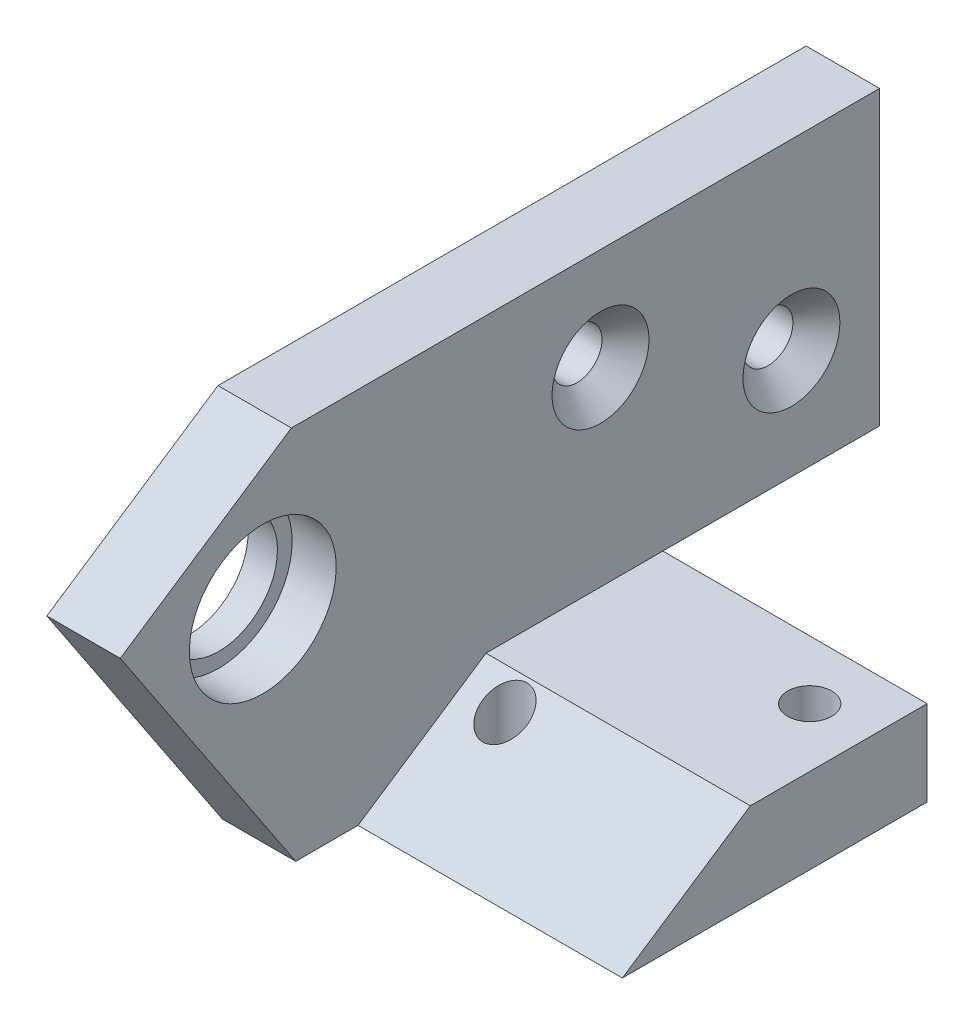
ISO-10303-21;
HEADER;
FILE_DESCRIPTION(('STEP AP214'),'2;1');
FILE_NAME('part.step','',(''),(''),'','','');
FILE_SCHEMA(('AUTOMOTIVE_DESIGN { 1 0 10303 214 1 1 1 1 }'));
ENDSEC;
DATA;
#1=APPLICATION_CONTEXT('core data for automotive mechanical design processes');
#2=APPLICATION_PROTOCOL_DEFINITION('international standard','automotive_design',2000,#1);
#3=PRODUCT_CONTEXT('',#1,'mechanical');
#4=PRODUCT('Part','Part','',(#3));
#5=PRODUCT_RELATED_PRODUCT_CATEGORY('part','',(#4));
#6=PRODUCT_DEFINITION_FORMATION('','',#4);
#7=PRODUCT_DEFINITION_CONTEXT('part definition',#1,'design');
#8=PRODUCT_DEFINITION('design','',#6,#7);
#9=PRODUCT_DEFINITION_SHAPE('','',#8);
#10=(LENGTH_UNIT() NAMED_UNIT(*) SI_UNIT(.MILLI.,.METRE.));
#11=(NAMED_UNIT(*) PLANE_ANGLE_UNIT() SI_UNIT($,.RADIAN.));
#12=(NAMED_UNIT(*) SI_UNIT($,.STERADIAN.) SOLID_ANGLE_UNIT());
#13=UNCERTAINTY_MEASURE_WITH_UNIT(LENGTH_MEASURE(1.E-05),#10,'distance_accuracy_value','');
#14=(GEOMETRIC_REPRESENTATION_CONTEXT(3) GLOBAL_UNCERTAINTY_ASSIGNED_CONTEXT((#13)) GLOBAL_UNIT_ASSIGNED_CONTEXT((#10,
#11,#12)) REPRESENTATION_CONTEXT('',''));
#15=CARTESIAN_POINT('',(0.,0.,0.));
#16=DIRECTION('',(0.,0.,1.));
#17=DIRECTION('',(1.,0.,0.));
#18=AXIS2_PLACEMENT_3D('',#15,#16,#17);
#19=CARTESIAN_POINT('',(0.,0.,0.));
#20=DIRECTION('',(1.,0.,0.));
#21=DIRECTION('',(0.,0.,-1.));
#22=AXIS2_PLACEMENT_3D('',#19,#20,#21);
#23=PLANE('',#22);
#24=DIRECTION('',(0.,0.,-1.));
#25=VECTOR('',#24,1.);
#26=CARTESIAN_POINT('',(0.,0.,-25.));
#27=LINE('',#26,#25);
#28=CARTESIAN_POINT('',(0.,0.,-4.24463236054693));
#29=VERTEX_POINT('',#28);
#30=CARTESIAN_POINT('',(0.,0.,-25.));
#31=VERTEX_POINT('',#30);
#32=EDGE_CURVE('E128',#29,#31,#27,.T.);
#33=ORIENTED_EDGE('',*,*,#32,.T.);
#34=DIRECTION('',(0.,1.,0.));
#35=VECTOR('',#34,1.);
#36=CARTESIAN_POINT('',(0.,5.79991849324796,-25.));
#37=LINE('',#36,#35);
#38=CARTESIAN_POINT('',(0.,5.79991849324796,-25.));
#39=VERTEX_POINT('',#38);
#40=EDGE_CURVE('E113',#31,#39,#37,.T.);
#41=ORIENTED_EDGE('',*,*,#40,.T.);
#42=DIRECTION('',(0.,0.,1.));
#43=VECTOR('',#42,1.);
#44=CARTESIAN_POINT('',(0.,5.79991849324796,-12.9573640104081));
#45=LINE('',#44,#43);
#46=CARTESIAN_POINT('',(0.,5.79991849324796,-12.9573640104081));
#47=VERTEX_POINT('',#46);
#48=EDGE_CURVE('E124',#39,#47,#45,.T.);
#49=ORIENTED_EDGE('',*,*,#48,.T.);
#50=DIRECTION('',(0.,0.554133260159787,-0.832427972850917));
#51=VECTOR('',#50,1.);
#52=CARTESIAN_POINT('',(0.,-1.95794714898904,-1.30337239049531));
#53=LINE('',#52,#51);
#54=EDGE_CURVE('E127',#29,#47,#53,.T.);
#55=ORIENTED_EDGE('',*,*,#54,.F.);
#56=EDGE_LOOP('',(#33,#41,#49,#55));
#57=FACE_BOUND('',#56,.T.);
#58=ADVANCED_FACE('F33',(#57),#23,.T.);
#59=CARTESIAN_POINT('',(-21.,16.,2.24179415327121));
#60=DIRECTION('',(-1.,0.,0.));
#61=DIRECTION('',(0.,0.,-1.));
#62=AXIS2_PLACEMENT_3D('',#59,#60,#61);
#63=PLANE('',#62);
#64=CARTESIAN_POINT('',(-21.,16.,2.24179415327121));
#65=DIRECTION('',(1.,0.,0.));
#66=DIRECTION('',(0.,0.,-1.));
#67=AXIS2_PLACEMENT_3D('',#64,#65,#66);
#68=CIRCLE('',#67,5.);
#69=CARTESIAN_POINT('',(-21.,16.,-2.75820584672879));
#70=VERTEX_POINT('',#69);
#71=EDGE_CURVE('E166',#70,#70,#68,.T.);
#72=ORIENTED_EDGE('',*,*,#71,.T.);
#73=EDGE_LOOP('',(#72));
#74=FACE_BOUND('',#73,.T.);
#75=CARTESIAN_POINT('',(-21.,16.,2.24179415327121));
#76=DIRECTION('',(1.,0.,0.));
#77=DIRECTION('',(0.,0.,-1.));
#78=AXIS2_PLACEMENT_3D('',#75,#76,#77);
#79=CIRCLE('',#78,4.);
#80=CARTESIAN_POINT('',(-21.,16.,-1.75820584672879));
#81=VERTEX_POINT('',#80);
#82=EDGE_CURVE('E170',#81,#81,#79,.T.);
#83=ORIENTED_EDGE('',*,*,#82,.F.);
#84=EDGE_LOOP('',(#83));
#85=FACE_BOUND('',#84,.T.);
#86=ADVANCED_FACE('F268',(#74,#85),#63,.F.);
#87=CARTESIAN_POINT('',(-21.,16.,2.24179415327121));
#88=DIRECTION('',(-1.,0.,0.));
#89=DIRECTION('',(0.,0.,1.));
#90=AXIS2_PLACEMENT_3D('',#87,#88,#89);
#91=CYLINDRICAL_SURFACE('',#90,4.);
#92=ORIENTED_EDGE('',*,*,#82,.T.);
#93=EDGE_LOOP('',(#92));
#94=FACE_BOUND('',#93,.T.);
#95=CARTESIAN_POINT('',(-23.,16.,2.24179415327121));
#96=DIRECTION('',(1.,0.,0.));
#97=DIRECTION('',(0.,0.,-1.));
#98=AXIS2_PLACEMENT_3D('',#95,#96,#97);
#99=CIRCLE('',#98,4.);
#100=CARTESIAN_POINT('',(-23.,16.,-1.75820584672879));
#101=VERTEX_POINT('',#100);
#102=EDGE_CURVE('E171',#101,#101,#99,.T.);
#103=ORIENTED_EDGE('',*,*,#102,.F.);
#104=EDGE_LOOP('',(#103));
#105=FACE_BOUND('',#104,.T.);
#106=ADVANCED_FACE('F263',(#94,#105),#91,.F.);
#107=CARTESIAN_POINT('',(-18.,18.75,-20.7582058467288));
#108=DIRECTION('',(1.,0.,0.));
#109=DIRECTION('',(0.,0.,-1.));
#110=AXIS2_PLACEMENT_3D('',#107,#108,#109);
#111=CYLINDRICAL_SURFACE('',#110,1.69999999999999);
#112=CARTESIAN_POINT('',(-19.6,18.75,-20.7582058467288));
#113=DIRECTION('',(1.,0.,0.));
#114=DIRECTION('',(0.,0.,-1.));
#115=AXIS2_PLACEMENT_3D('',#112,#113,#114);
#116=CIRCLE('',#115,1.69999999999999);
#117=CARTESIAN_POINT('',(-19.6,18.75,-22.4582058467288));
#118=VERTEX_POINT('',#117);
#119=EDGE_CURVE('E197',#118,#118,#116,.T.);
#120=ORIENTED_EDGE('',*,*,#119,.T.);
#121=EDGE_LOOP('',(#120));
#122=FACE_BOUND('',#121,.T.);
#123=CARTESIAN_POINT('',(-23.,18.75,-20.7582058467288));
#124=DIRECTION('',(1.,0.,0.));
#125=DIRECTION('',(0.,0.,-1.));
#126=AXIS2_PLACEMENT_3D('',#123,#124,#125);
#127=CIRCLE('',#126,1.69999999999999);
#128=CARTESIAN_POINT('',(-23.,18.75,-22.4582058467288));
#129=VERTEX_POINT('',#128);
#130=EDGE_CURVE('E192',#129,#129,#127,.T.);
#131=ORIENTED_EDGE('',*,*,#130,.F.);
#132=EDGE_LOOP('',(#131));
#133=FACE_BOUND('',#132,.T.);
#134=ADVANCED_FACE('F253',(#122,#133),#111,.F.);
#135=CARTESIAN_POINT('',(-18.,13.25,-33.7582058467288));
#136=DIRECTION('',(1.,0.,0.));
#137=DIRECTION('',(0.,0.,-1.));
#138=AXIS2_PLACEMENT_3D('',#135,#136,#137);
#139=CYLINDRICAL_SURFACE('',#138,1.69999999999999);
#140=CARTESIAN_POINT('',(-19.6,13.25,-33.7582058467288));
#141=DIRECTION('',(1.,0.,0.));
#142=DIRECTION('',(0.,0.,-1.));
#143=AXIS2_PLACEMENT_3D('',#140,#141,#142);
#144=CIRCLE('',#143,1.69999999999999);
#145=CARTESIAN_POINT('',(-19.6,13.25,-35.4582058467288));
#146=VERTEX_POINT('',#145);
#147=EDGE_CURVE('E204',#146,#146,#144,.T.);
#148=ORIENTED_EDGE('',*,*,#147,.T.);
#149=EDGE_LOOP('',(#148));
#150=FACE_BOUND('',#149,.T.);
#151=CARTESIAN_POINT('',(-23.,13.25,-33.7582058467288));
#152=DIRECTION('',(1.,0.,0.));
#153=DIRECTION('',(0.,0.,-1.));
#154=AXIS2_PLACEMENT_3D('',#151,#152,#153);
#155=CIRCLE('',#154,1.69999999999999);
#156=CARTESIAN_POINT('',(-23.,13.25,-35.4582058467288));
#157=VERTEX_POINT('',#156);
#158=EDGE_CURVE('E203',#157,#157,#155,.T.);
#159=ORIENTED_EDGE('',*,*,#158,.F.);
#160=EDGE_LOOP('',(#159));
#161=FACE_BOUND('',#160,.T.);
#162=ADVANCED_FACE('F250',(#150,#161),#139,.F.);
#163=CARTESIAN_POINT('',(23.,17.9480629888379,11.9477227843461));
#164=DIRECTION('',(0.,-0.832427972850917,-0.554133260159787));
#165=DIRECTION('',(0.,0.554133260159787,-0.832427972850917));
#166=AXIS2_PLACEMENT_3D('',#163,#164,#165);
#167=PLANE('',#166);
#168=DIRECTION('',(-1.,0.,0.));
#169=VECTOR('',#168,1.);
#170=CARTESIAN_POINT('',(23.,17.9480629888379,11.9477227843461));
#171=LINE('',#170,#169);
#172=CARTESIAN_POINT('',(-18.,17.9480629888379,11.9477227843461));
#173=VERTEX_POINT('',#172);
#174=CARTESIAN_POINT('',(-23.,17.9480629888379,11.9477227843461));
#175=VERTEX_POINT('',#174);
#176=EDGE_CURVE('E137',#173,#175,#171,.T.);
#177=ORIENTED_EDGE('',*,*,#176,.F.);
#178=DIRECTION('',(0.,-0.554133260159787,0.832427972850917));
#179=VECTOR('',#178,1.);
#180=CARTESIAN_POINT('',(-18.,25.7059286310749,0.293731164433316));
#181=LINE('',#180,#179);
#182=CARTESIAN_POINT('',(-18.,25.7059286310749,0.293731164433316));
#183=VERTEX_POINT('',#182);
#184=EDGE_CURVE('E164',#183,#173,#181,.T.);
#185=ORIENTED_EDGE('',*,*,#184,.F.);
#186=DIRECTION('',(-1.,0.,0.));
#187=VECTOR('',#186,1.);
#188=CARTESIAN_POINT('',(23.,25.7059286310749,0.293731164433303));
#189=LINE('',#188,#187);
#190=CARTESIAN_POINT('',(-23.,25.7059286310749,0.293731164433303));
#191=VERTEX_POINT('',#190);
#192=EDGE_CURVE('E119',#183,#191,#189,.T.);
#193=ORIENTED_EDGE('',*,*,#192,.T.);
#194=DIRECTION('',(0.,-0.554133260159787,0.832427972850916));
#195=VECTOR('',#194,1.);
#196=CARTESIAN_POINT('',(-23.,17.9480629888379,11.9477227843461));
#197=LINE('',#196,#195);
#198=EDGE_CURVE('E156',#191,#175,#197,.T.);
#199=ORIENTED_EDGE('',*,*,#198,.T.);
#200=EDGE_LOOP('',(#177,#185,#193,#199));
#201=FACE_BOUND('',#200,.T.);
#202=ADVANCED_FACE('F252',(#201),#167,.F.);
#203=CARTESIAN_POINT('',(26.7251547153442,25.7059286310749,-39.7573640104081));
#204=DIRECTION('',(0.,1.,0.));
#205=DIRECTION('',(0.,0.,1.));
#206=AXIS2_PLACEMENT_3D('',#203,#204,#205);
#207=PLANE('',#206);
#208=DIRECTION('',(0.,0.,1.));
#209=VECTOR('',#208,1.);
#210=CARTESIAN_POINT('',(-18.,25.7059286310749,-39.7573640104081));
#211=LINE('',#210,#209);
#212=CARTESIAN_POINT('',(-18.,25.7059286310749,-39.7573640104081));
#213=VERTEX_POINT('',#212);
#214=EDGE_CURVE('E177',#213,#183,#211,.T.);
#215=ORIENTED_EDGE('',*,*,#214,.F.);
#216=DIRECTION('',(-1.,0.,0.));
#217=VECTOR('',#216,1.);
#218=CARTESIAN_POINT('',(26.7251547153442,25.7059286310749,-39.7573640104081));
#219=LINE('',#218,#217);
#220=CARTESIAN_POINT('',(-23.,25.7059286310749,-39.7573640104081));
#221=VERTEX_POINT('',#220);
#222=EDGE_CURVE('E55',#213,#221,#219,.T.);
#223=ORIENTED_EDGE('',*,*,#222,.T.);
#224=DIRECTION('',(0.,0.,-1.));
#225=VECTOR('',#224,1.);
#226=CARTESIAN_POINT('',(-23.,25.7059286310749,-39.7573640104081));
#227=LINE('',#226,#225);
#228=EDGE_CURVE('E50',#191,#221,#227,.T.);
#229=ORIENTED_EDGE('',*,*,#228,.F.);
#230=ORIENTED_EDGE('',*,*,#192,.F.);
#231=EDGE_LOOP('',(#215,#223,#229,#230));
#232=FACE_BOUND('',#231,.T.);
#233=ADVANCED_FACE('F260',(#232),#207,.T.);
#234=CARTESIAN_POINT('',(26.7251547153442,5.79991849324795,-39.7573640104081));
#235=DIRECTION('',(0.,0.,-1.));
#236=DIRECTION('',(-1.,0.,0.));
#237=AXIS2_PLACEMENT_3D('',#234,#235,#236);
#238=PLANE('',#237);
#239=DIRECTION('',(0.,1.,0.));
#240=VECTOR('',#239,1.);
#241=CARTESIAN_POINT('',(-18.,5.79991849324795,-39.7573640104081));
#242=LINE('',#241,#240);
#243=CARTESIAN_POINT('',(-18.,5.79991849324795,-39.7573640104081));
#244=VERTEX_POINT('',#243);
#245=EDGE_CURVE('E185',#244,#213,#242,.T.);
#246=ORIENTED_EDGE('',*,*,#245,.F.);
#247=DIRECTION('',(-1.,0.,0.));
#248=VECTOR('',#247,1.);
#249=CARTESIAN_POINT('',(26.7251547153442,5.79991849324795,-39.7573640104081));
#250=LINE('',#249,#248);
#251=CARTESIAN_POINT('',(-23.,5.79991849324795,-39.7573640104081));
#252=VERTEX_POINT('',#251);
#253=EDGE_CURVE('E183',#244,#252,#250,.T.);
#254=ORIENTED_EDGE('',*,*,#253,.T.);
#255=DIRECTION('',(0.,-1.,0.));
#256=VECTOR('',#255,1.);
#257=CARTESIAN_POINT('',(-23.,5.79991849324795,-39.7573640104081));
#258=LINE('',#257,#256);
#259=EDGE_CURVE('E188',#221,#252,#258,.T.);
#260=ORIENTED_EDGE('',*,*,#259,.F.);
#261=ORIENTED_EDGE('',*,*,#222,.F.);
#262=EDGE_LOOP('',(#246,#254,#260,#261));
#263=FACE_BOUND('',#262,.T.);
#264=ADVANCED_FACE('F285',(#263),#238,.T.);
#265=CARTESIAN_POINT('',(23.,16.,2.24179415327121));
#266=DIRECTION('',(-1.,0.,0.));
#267=DIRECTION('',(0.,0.,1.));
#268=AXIS2_PLACEMENT_3D('',#265,#266,#267);
#269=CYLINDRICAL_SURFACE('',#268,5.);
#270=CARTESIAN_POINT('',(-18.,16.,2.24179415327121));
#271=DIRECTION('',(-1.,0.,0.));
#272=DIRECTION('',(0.,0.,1.));
#273=AXIS2_PLACEMENT_3D('',#270,#271,#272);
#274=CIRCLE('',#273,5.);
#275=CARTESIAN_POINT('',(-18.,16.,7.24179415327121));
#276=VERTEX_POINT('',#275);
#277=EDGE_CURVE('E149',#276,#276,#274,.T.);
#278=ORIENTED_EDGE('',*,*,#277,.F.);
#279=EDGE_LOOP('',(#278));
#280=FACE_BOUND('',#279,.T.);
#281=ORIENTED_EDGE('',*,*,#71,.F.);
#282=EDGE_LOOP('',(#281));
#283=FACE_BOUND('',#282,.T.);
#284=ADVANCED_FACE('F288',(#280,#283),#269,.F.);
#285=CARTESIAN_POINT('',(-18.,18.75,-20.7582058467288));
#286=DIRECTION('',(1.,0.,0.));
#287=DIRECTION('',(0.,0.,-1.));
#288=AXIS2_PLACEMENT_3D('',#285,#286,#287);
#289=CONICAL_SURFACE('',#288,3.3,0.785398163397447);
#290=ORIENTED_EDGE('',*,*,#119,.F.);
#291=EDGE_LOOP('',(#290));
#292=FACE_BOUND('',#291,.T.);
#293=CARTESIAN_POINT('',(-18.,18.75,-20.7582058467288));
#294=DIRECTION('',(1.,0.,0.));
#295=DIRECTION('',(0.,0.,-1.));
#296=AXIS2_PLACEMENT_3D('',#293,#294,#295);
#297=CIRCLE('',#296,3.3);
#298=CARTESIAN_POINT('',(-18.,18.75,-24.0582058467288));
#299=VERTEX_POINT('',#298);
#300=EDGE_CURVE('E200',#299,#299,#297,.T.);
#301=ORIENTED_EDGE('',*,*,#300,.T.);
#302=EDGE_LOOP('',(#301));
#303=FACE_BOUND('',#302,.T.);
#304=ADVANCED_FACE('F292',(#292,#303),#289,.F.);
#305=CARTESIAN_POINT('',(-18.,13.25,-33.7582058467288));
#306=DIRECTION('',(1.,0.,0.));
#307=DIRECTION('',(0.,0.,-1.));
#308=AXIS2_PLACEMENT_3D('',#305,#306,#307);
#309=CONICAL_SURFACE('',#308,3.3,0.785398163397446);
#310=ORIENTED_EDGE('',*,*,#147,.F.);
#311=EDGE_LOOP('',(#310));
#312=FACE_BOUND('',#311,.T.);
#313=CARTESIAN_POINT('',(-18.,13.25,-33.7582058467288));
#314=DIRECTION('',(1.,0.,0.));
#315=DIRECTION('',(0.,0.,-1.));
#316=AXIS2_PLACEMENT_3D('',#313,#314,#315);
#317=CIRCLE('',#316,3.3);
#318=CARTESIAN_POINT('',(-18.,13.25,-37.0582058467288));
#319=VERTEX_POINT('',#318);
#320=EDGE_CURVE('E207',#319,#319,#317,.T.);
#321=ORIENTED_EDGE('',*,*,#320,.T.);
#322=EDGE_LOOP('',(#321));
#323=FACE_BOUND('',#322,.T.);
#324=ADVANCED_FACE('F294',(#312,#323),#309,.F.);
#325=CARTESIAN_POINT('',(23.,0.,0.));
#326=DIRECTION('',(0.,0.554133260159787,-0.832427972850916));
#327=DIRECTION('',(0.,0.832427972850917,0.554133260159787));
#328=AXIS2_PLACEMENT_3D('',#325,#326,#327);
#329=PLANE('',#328);
#330=DIRECTION('',(-1.,0.,0.));
#331=VECTOR('',#330,1.);
#332=CARTESIAN_POINT('',(23.,0.,0.));
#333=LINE('',#332,#331);
#334=CARTESIAN_POINT('',(-18.,0.,0.));
#335=VERTEX_POINT('',#334);
#336=CARTESIAN_POINT('',(-23.,0.,0.));
#337=VERTEX_POINT('',#336);
#338=EDGE_CURVE('E139',#335,#337,#333,.T.);
#339=ORIENTED_EDGE('',*,*,#338,.F.);
#340=DIRECTION('',(0.,0.832427972850916,0.554133260159787));
#341=VECTOR('',#340,1.);
#342=CARTESIAN_POINT('',(-18.,-1.95794714898905,-1.30337239049531));
#343=LINE('',#342,#341);
#344=EDGE_CURVE('E160',#335,#173,#343,.T.);
#345=ORIENTED_EDGE('',*,*,#344,.T.);
#346=ORIENTED_EDGE('',*,*,#176,.T.);
#347=DIRECTION('',(0.,-0.832427972850917,-0.554133260159787));
#348=VECTOR('',#347,1.);
#349=CARTESIAN_POINT('',(-23.,0.,0.));
#350=LINE('',#349,#348);
#351=EDGE_CURVE('E140',#175,#337,#350,.T.);
#352=ORIENTED_EDGE('',*,*,#351,.T.);
#353=EDGE_LOOP('',(#339,#345,#346,#352));
#354=FACE_BOUND('',#353,.T.);
#355=ADVANCED_FACE('F235',(#354),#329,.F.);
#356=CARTESIAN_POINT('',(-4.,0.,-21.));
#357=DIRECTION('',(0.,-1.,0.));
#358=DIRECTION('',(0.,0.,-1.));
#359=AXIS2_PLACEMENT_3D('',#356,#357,#358);
#360=CYLINDRICAL_SURFACE('',#359,1.49999999999999);
#361=CARTESIAN_POINT('',(-4.,0.,-21.));
#362=DIRECTION('',(0.,-1.,0.));
#363=DIRECTION('',(0.,0.,-1.));
#364=AXIS2_PLACEMENT_3D('',#361,#362,#363);
#365=CIRCLE('',#364,1.49999999999999);
#366=CARTESIAN_POINT('',(-4.,0.,-22.5));
#367=VERTEX_POINT('',#366);
#368=EDGE_CURVE('E11',#367,#367,#365,.T.);
#369=ORIENTED_EDGE('',*,*,#368,.T.);
#370=EDGE_LOOP('',(#369));
#371=FACE_BOUND('',#370,.T.);
#372=CARTESIAN_POINT('',(-4.,5.79991849324796,-21.));
#373=DIRECTION('',(0.,-1.,0.));
#374=DIRECTION('',(0.,0.,-1.));
#375=AXIS2_PLACEMENT_3D('',#372,#373,#374);
#376=CIRCLE('',#375,1.49999999999999);
#377=CARTESIAN_POINT('',(-4.,5.79991849324796,-22.5));
#378=VERTEX_POINT('',#377);
#379=EDGE_CURVE('E42',#378,#378,#376,.T.);
#380=ORIENTED_EDGE('',*,*,#379,.F.);
#381=EDGE_LOOP('',(#380));
#382=FACE_BOUND('',#381,.T.);
#383=ADVANCED_FACE('F291',(#371,#382),#360,.F.);
#384=CARTESIAN_POINT('',(26.7251547153442,5.79991849324796,-12.9573640104081));
#385=DIRECTION('',(0.,-1.,0.));
#386=DIRECTION('',(0.,0.,-1.));
#387=AXIS2_PLACEMENT_3D('',#384,#385,#386);
#388=PLANE('',#387);
#389=DIRECTION('',(1.,0.,0.));
#390=VECTOR('',#389,1.);
#391=CARTESIAN_POINT('',(23.,5.79991849324795,-25.));
#392=LINE('',#391,#390);
#393=CARTESIAN_POINT('',(-23.,5.79991849324795,-25.));
#394=VERTEX_POINT('',#393);
#395=CARTESIAN_POINT('',(-18.,5.79991849324795,-25.));
#396=VERTEX_POINT('',#395);
#397=EDGE_CURVE('E115',#394,#396,#392,.T.);
#398=ORIENTED_EDGE('',*,*,#397,.F.);
#399=DIRECTION('',(0.,0.,1.));
#400=VECTOR('',#399,1.);
#401=CARTESIAN_POINT('',(-23.,5.79991849324796,-12.9573640104081));
#402=LINE('',#401,#400);
#403=EDGE_CURVE('E182',#252,#394,#402,.T.);
#404=ORIENTED_EDGE('',*,*,#403,.F.);
#405=ORIENTED_EDGE('',*,*,#253,.F.);
#406=DIRECTION('',(0.,0.,-1.));
#407=VECTOR('',#406,1.);
#408=CARTESIAN_POINT('',(-18.,5.79991849324796,-12.9573640104081));
#409=LINE('',#408,#407);
#410=EDGE_CURVE('E195',#396,#244,#409,.T.);
#411=ORIENTED_EDGE('',*,*,#410,.F.);
#412=EDGE_LOOP('',(#398,#404,#405,#411));
#413=FACE_BOUND('',#412,.T.);
#414=ADVANCED_FACE('F227',(#413),#388,.T.);
#415=CARTESIAN_POINT('',(-23.,0.,0.));
#416=DIRECTION('',(1.,0.,0.));
#417=DIRECTION('',(0.,0.,-1.));
#418=AXIS2_PLACEMENT_3D('',#415,#416,#417);
#419=PLANE('',#418);
#420=ORIENTED_EDGE('',*,*,#158,.T.);
#421=EDGE_LOOP('',(#420));
#422=FACE_BOUND('',#421,.T.);
#423=ORIENTED_EDGE('',*,*,#130,.T.);
#424=EDGE_LOOP('',(#423));
#425=FACE_BOUND('',#424,.T.);
#426=DIRECTION('',(0.,0.,-1.));
#427=VECTOR('',#426,1.);
#428=CARTESIAN_POINT('',(-23.,0.,-25.));
#429=LINE('',#428,#427);
#430=CARTESIAN_POINT('',(-23.,0.,-25.));
#431=VERTEX_POINT('',#430);
#432=EDGE_CURVE('E144',#337,#431,#429,.T.);
#433=ORIENTED_EDGE('',*,*,#432,.F.);
#434=ORIENTED_EDGE('',*,*,#351,.F.);
#435=ORIENTED_EDGE('',*,*,#198,.F.);
#436=ORIENTED_EDGE('',*,*,#228,.T.);
#437=ORIENTED_EDGE('',*,*,#259,.T.);
#438=ORIENTED_EDGE('',*,*,#403,.T.);
#439=DIRECTION('',(0.,1.,0.));
#440=VECTOR('',#439,1.);
#441=CARTESIAN_POINT('',(-23.,5.79991849324796,-25.));
#442=LINE('',#441,#440);
#443=EDGE_CURVE('E152',#431,#394,#442,.T.);
#444=ORIENTED_EDGE('',*,*,#443,.F.);
#445=EDGE_LOOP('',(#433,#434,#435,#436,#437,#438,#444));
#446=FACE_BOUND('',#445,.T.);
#447=ORIENTED_EDGE('',*,*,#102,.T.);
#448=EDGE_LOOP('',(#447));
#449=FACE_BOUND('',#448,.T.);
#450=ADVANCED_FACE('F221',(#422,#425,#446,#449),#419,.F.);
#451=CARTESIAN_POINT('',(-18.,5.79991849324796,-12.9573640104081));
#452=DIRECTION('',(-1.,0.,0.));
#453=DIRECTION('',(0.,0.,1.));
#454=AXIS2_PLACEMENT_3D('',#451,#452,#453);
#455=PLANE('',#454);
#456=ORIENTED_EDGE('',*,*,#320,.F.);
#457=EDGE_LOOP('',(#456));
#458=FACE_BOUND('',#457,.T.);
#459=ORIENTED_EDGE('',*,*,#300,.F.);
#460=EDGE_LOOP('',(#459));
#461=FACE_BOUND('',#460,.T.);
#462=ORIENTED_EDGE('',*,*,#277,.T.);
#463=EDGE_LOOP('',(#462));
#464=FACE_BOUND('',#463,.T.);
#465=DIRECTION('',(0.,-0.554133260159787,0.832427972850917));
#466=VECTOR('',#465,1.);
#467=CARTESIAN_POINT('',(-18.,5.79991849324796,-12.9573640104081));
#468=LINE('',#467,#466);
#469=CARTESIAN_POINT('',(-18.,5.79991849324796,-12.9573640104081));
#470=VERTEX_POINT('',#469);
#471=CARTESIAN_POINT('',(-18.,0.,-4.24463236054693));
#472=VERTEX_POINT('',#471);
#473=EDGE_CURVE('E163',#470,#472,#468,.T.);
#474=ORIENTED_EDGE('',*,*,#473,.F.);
#475=EDGE_CURVE('E180',#470,#396,#409,.T.);
#476=ORIENTED_EDGE('',*,*,#475,.T.);
#477=ORIENTED_EDGE('',*,*,#410,.T.);
#478=ORIENTED_EDGE('',*,*,#245,.T.);
#479=ORIENTED_EDGE('',*,*,#214,.T.);
#480=ORIENTED_EDGE('',*,*,#184,.T.);
#481=ORIENTED_EDGE('',*,*,#344,.F.);
#482=DIRECTION('',(0.,0.,1.));
#483=VECTOR('',#482,1.);
#484=CARTESIAN_POINT('',(-18.,0.,-25.));
#485=LINE('',#484,#483);
#486=EDGE_CURVE('E143',#472,#335,#485,.T.);
#487=ORIENTED_EDGE('',*,*,#486,.F.);
#488=EDGE_LOOP('',(#474,#476,#477,#478,#479,#480,#481,#487));
#489=FACE_BOUND('',#488,.T.);
#490=ADVANCED_FACE('F231',(#458,#461,#464,#489),#455,.F.);
#491=CARTESIAN_POINT('',(23.,5.79991849324796,-12.9573640104081));
#492=DIRECTION('',(0.,-1.,0.));
#493=DIRECTION('',(0.,0.,-1.));
#494=AXIS2_PLACEMENT_3D('',#491,#492,#493);
#495=PLANE('',#494);
#496=ORIENTED_EDGE('',*,*,#379,.T.);
#497=EDGE_LOOP('',(#496));
#498=FACE_BOUND('',#497,.T.);
#499=ORIENTED_EDGE('',*,*,#48,.F.);
#500=DIRECTION('',(-1.,0.,0.));
#501=VECTOR('',#500,1.);
#502=CARTESIAN_POINT('',(23.,5.79991849324796,-25.));
#503=LINE('',#502,#501);
#504=EDGE_CURVE('E109',#39,#396,#503,.T.);
#505=ORIENTED_EDGE('',*,*,#504,.T.);
#506=ORIENTED_EDGE('',*,*,#475,.F.);
#507=DIRECTION('',(-1.,0.,0.));
#508=VECTOR('',#507,1.);
#509=CARTESIAN_POINT('',(-18.,5.79991849324796,-12.9573640104081));
#510=LINE('',#509,#508);
#511=EDGE_CURVE('E37',#47,#470,#510,.T.);
#512=ORIENTED_EDGE('',*,*,#511,.F.);
#513=EDGE_LOOP('',(#499,#505,#506,#512));
#514=FACE_BOUND('',#513,.T.);
#515=ADVANCED_FACE('F125',(#498,#514),#495,.F.);
#516=CARTESIAN_POINT('',(23.,0.,-25.));
#517=DIRECTION('',(0.,1.,0.));
#518=DIRECTION('',(0.,0.,1.));
#519=AXIS2_PLACEMENT_3D('',#516,#517,#518);
#520=PLANE('',#519);
#521=CARTESIAN_POINT('',(-15.,0.,-11.244632360547));
#522=DIRECTION('',(0.,-1.,0.));
#523=DIRECTION('',(0.,0.,-1.));
#524=AXIS2_PLACEMENT_3D('',#521,#522,#523);
#525=CIRCLE('',#524,1.49999999999999);
#526=CARTESIAN_POINT('',(-15.,0.,-12.744632360547));
#527=VERTEX_POINT('',#526);
#528=EDGE_CURVE('E213',#527,#527,#525,.T.);
#529=ORIENTED_EDGE('',*,*,#528,.F.);
#530=EDGE_LOOP('',(#529));
#531=FACE_BOUND('',#530,.T.);
#532=ORIENTED_EDGE('',*,*,#368,.F.);
#533=EDGE_LOOP('',(#532));
#534=FACE_BOUND('',#533,.T.);
#535=ORIENTED_EDGE('',*,*,#32,.F.);
#536=DIRECTION('',(1.,0.,0.));
#537=VECTOR('',#536,1.);
#538=CARTESIAN_POINT('',(23.,0.,-4.24463236054693));
#539=LINE('',#538,#537);
#540=EDGE_CURVE('E141',#472,#29,#539,.T.);
#541=ORIENTED_EDGE('',*,*,#540,.F.);
#542=ORIENTED_EDGE('',*,*,#486,.T.);
#543=ORIENTED_EDGE('',*,*,#338,.T.);
#544=ORIENTED_EDGE('',*,*,#432,.T.);
#545=DIRECTION('',(-1.,0.,0.));
#546=VECTOR('',#545,1.);
#547=CARTESIAN_POINT('',(23.,0.,-25.));
#548=LINE('',#547,#546);
#549=EDGE_CURVE('E120',#31,#431,#548,.T.);
#550=ORIENTED_EDGE('',*,*,#549,.F.);
#551=EDGE_LOOP('',(#535,#541,#542,#543,#544,#550));
#552=FACE_BOUND('',#551,.T.);
#553=ADVANCED_FACE('F218',(#531,#534,#552),#520,.F.);
#554=CARTESIAN_POINT('',(-15.,0.,-11.244632360547));
#555=DIRECTION('',(0.,-1.,0.));
#556=DIRECTION('',(0.,0.,-1.));
#557=AXIS2_PLACEMENT_3D('',#554,#555,#556);
#558=CYLINDRICAL_SURFACE('',#557,1.49999999999999);
#559=CARTESIAN_POINT('',(-15.,4.65978192423529,-11.244632360547));
#560=DIRECTION('',(0.,0.832427972850917,0.554133260159787));
#561=DIRECTION('',(0.,-0.554133260159787,0.832427972850917));
#562=AXIS2_PLACEMENT_3D('',#559,#560,#561);
#563=ELLIPSE('',#562,1.80195770555711,1.49999999999999);
#564=CARTESIAN_POINT('',(-15.,3.66125722618488,-9.74463236054698));
#565=VERTEX_POINT('',#564);
#566=EDGE_CURVE('E210',#565,#565,#563,.T.);
#567=ORIENTED_EDGE('',*,*,#566,.T.);
#568=EDGE_LOOP('',(#567));
#569=FACE_BOUND('',#568,.T.);
#570=ORIENTED_EDGE('',*,*,#528,.T.);
#571=EDGE_LOOP('',(#570));
#572=FACE_BOUND('',#571,.T.);
#573=ADVANCED_FACE('F434',(#569,#572),#558,.F.);
#574=CARTESIAN_POINT('',(0.,-1.95794714898904,-1.30337239049531));
#575=DIRECTION('',(0.,0.832427972850917,0.554133260159787));
#576=DIRECTION('',(0.,-0.554133260159787,0.832427972850917));
#577=AXIS2_PLACEMENT_3D('',#574,#575,#576);
#578=PLANE('',#577);
#579=ORIENTED_EDGE('',*,*,#566,.F.);
#580=EDGE_LOOP('',(#579));
#581=FACE_BOUND('',#580,.T.);
#582=ORIENTED_EDGE('',*,*,#540,.T.);
#583=ORIENTED_EDGE('',*,*,#54,.T.);
#584=ORIENTED_EDGE('',*,*,#511,.T.);
#585=ORIENTED_EDGE('',*,*,#473,.T.);
#586=EDGE_LOOP('',(#582,#583,#584,#585));
#587=FACE_BOUND('',#586,.T.);
#588=ADVANCED_FACE('F35',(#581,#587),#578,.T.);
#589=CARTESIAN_POINT('',(23.,5.79991849324796,-25.));
#590=DIRECTION('',(0.,0.,1.));
#591=DIRECTION('',(1.,0.,0.));
#592=AXIS2_PLACEMENT_3D('',#589,#590,#591);
#593=PLANE('',#592);
#594=ORIENTED_EDGE('',*,*,#40,.F.);
#595=ORIENTED_EDGE('',*,*,#549,.T.);
#596=ORIENTED_EDGE('',*,*,#443,.T.);
#597=ORIENTED_EDGE('',*,*,#397,.T.);
#598=ORIENTED_EDGE('',*,*,#504,.F.);
#599=EDGE_LOOP('',(#594,#595,#596,#597,#598));
#600=FACE_BOUND('',#599,.T.);
#601=ADVANCED_FACE('F111',(#600),#593,.F.);
#602=CLOSED_SHELL('',(#58,#86,#106,#134,#162,#202,#233,#264,#284,#304,#324,#355,#383,#414,#450,
#490,#515,#553,#573,#588,#601));
#603=MANIFOLD_SOLID_BREP('B2',#602);
#604=ADVANCED_BREP_SHAPE_REPRESENTATION('',(#18,#603),#14);
#605=SHAPE_DEFINITION_REPRESENTATION(#9,#604);
ENDSEC;
END-ISO-10303-21;
